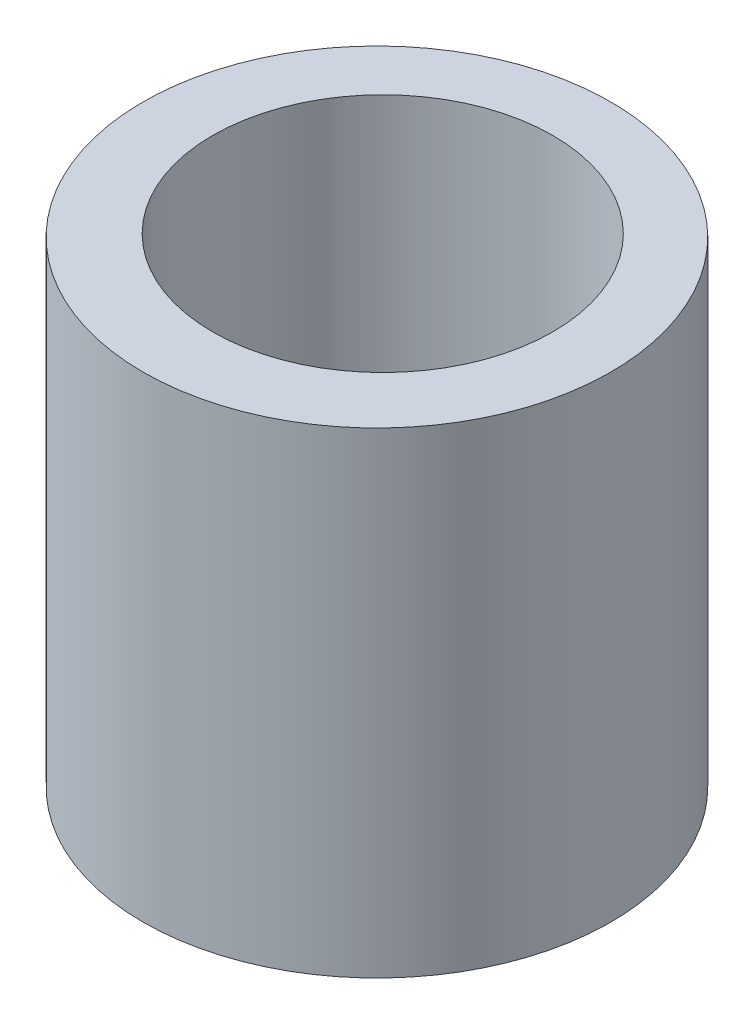
ISO-10303-21;
HEADER;
FILE_DESCRIPTION(('STEP AP214'),'2;1');
FILE_NAME('part.step','',(''),(''),'','','');
FILE_SCHEMA(('AUTOMOTIVE_DESIGN { 1 0 10303 214 1 1 1 1 }'));
ENDSEC;
DATA;
#1=APPLICATION_CONTEXT('core data for automotive mechanical design processes');
#2=APPLICATION_PROTOCOL_DEFINITION('international standard','automotive_design',2000,#1);
#3=PRODUCT_CONTEXT('',#1,'mechanical');
#4=PRODUCT('Part','Part','',(#3));
#5=PRODUCT_RELATED_PRODUCT_CATEGORY('part','',(#4));
#6=PRODUCT_DEFINITION_FORMATION('','',#4);
#7=PRODUCT_DEFINITION_CONTEXT('part definition',#1,'design');
#8=PRODUCT_DEFINITION('design','',#6,#7);
#9=PRODUCT_DEFINITION_SHAPE('','',#8);
#10=(LENGTH_UNIT() NAMED_UNIT(*) SI_UNIT(.MILLI.,.METRE.));
#11=(NAMED_UNIT(*) PLANE_ANGLE_UNIT() SI_UNIT($,.RADIAN.));
#12=(NAMED_UNIT(*) SI_UNIT($,.STERADIAN.) SOLID_ANGLE_UNIT());
#13=UNCERTAINTY_MEASURE_WITH_UNIT(LENGTH_MEASURE(1.E-05),#10,'distance_accuracy_value','');
#14=(GEOMETRIC_REPRESENTATION_CONTEXT(3) GLOBAL_UNCERTAINTY_ASSIGNED_CONTEXT((#13)) GLOBAL_UNIT_ASSIGNED_CONTEXT((#10,
#11,#12)) REPRESENTATION_CONTEXT('',''));
#15=CARTESIAN_POINT('',(0.,0.,0.));
#16=DIRECTION('',(0.,0.,1.));
#17=DIRECTION('',(1.,0.,0.));
#18=AXIS2_PLACEMENT_3D('',#15,#16,#17);
#19=CARTESIAN_POINT('',(0.,14.224,0.172602908569297));
#20=DIRECTION('',(0.,1.,0.));
#21=DIRECTION('',(0.,0.,1.));
#22=AXIS2_PLACEMENT_3D('',#19,#20,#21);
#23=PLANE('',#22);
#24=CARTESIAN_POINT('',(0.,14.224,0.172602908569297));
#25=DIRECTION('',(0.,1.,0.));
#26=DIRECTION('',(0.,0.,1.));
#27=AXIS2_PLACEMENT_3D('',#24,#25,#26);
#28=CIRCLE('',#27,6.985);
#29=CARTESIAN_POINT('',(0.,14.224,7.1576029085693));
#30=VERTEX_POINT('',#29);
#31=EDGE_CURVE('E10',#30,#30,#28,.T.);
#32=ORIENTED_EDGE('',*,*,#31,.T.);
#33=EDGE_LOOP('',(#32));
#34=FACE_BOUND('',#33,.T.);
#35=CARTESIAN_POINT('',(0.,14.224,0.));
#36=DIRECTION('',(0.,1.,0.));
#37=DIRECTION('',(0.,0.,1.));
#38=AXIS2_PLACEMENT_3D('',#35,#36,#37);
#39=CIRCLE('',#38,5.08);
#40=CARTESIAN_POINT('',(0.,14.224,5.08));
#41=VERTEX_POINT('',#40);
#42=EDGE_CURVE('E42',#41,#41,#39,.T.);
#43=ORIENTED_EDGE('',*,*,#42,.F.);
#44=EDGE_LOOP('',(#43));
#45=FACE_BOUND('',#44,.T.);
#46=ADVANCED_FACE('F31',(#34,#45),#23,.T.);
#47=CARTESIAN_POINT('',(0.,0.,0.172602908569297));
#48=DIRECTION('',(0.,1.,0.));
#49=DIRECTION('',(0.,0.,1.));
#50=AXIS2_PLACEMENT_3D('',#47,#48,#49);
#51=PLANE('',#50);
#52=CARTESIAN_POINT('',(0.,0.,0.172602908569297));
#53=DIRECTION('',(0.,1.,0.));
#54=DIRECTION('',(0.,0.,1.));
#55=AXIS2_PLACEMENT_3D('',#52,#53,#54);
#56=CIRCLE('',#55,6.985);
#57=CARTESIAN_POINT('',(0.,0.,7.1576029085693));
#58=VERTEX_POINT('',#57);
#59=EDGE_CURVE('E35',#58,#58,#56,.T.);
#60=ORIENTED_EDGE('',*,*,#59,.F.);
#61=EDGE_LOOP('',(#60));
#62=FACE_BOUND('',#61,.T.);
#63=CARTESIAN_POINT('',(0.,0.,0.));
#64=DIRECTION('',(0.,1.,0.));
#65=DIRECTION('',(0.,0.,1.));
#66=AXIS2_PLACEMENT_3D('',#63,#64,#65);
#67=CIRCLE('',#66,5.08);
#68=CARTESIAN_POINT('',(0.,0.,5.08));
#69=VERTEX_POINT('',#68);
#70=EDGE_CURVE('E44',#69,#69,#67,.T.);
#71=ORIENTED_EDGE('',*,*,#70,.T.);
#72=EDGE_LOOP('',(#71));
#73=FACE_BOUND('',#72,.T.);
#74=ADVANCED_FACE('F54',(#62,#73),#51,.F.);
#75=CARTESIAN_POINT('',(0.,14.224,0.172602908569297));
#76=DIRECTION('',(0.,-1.,0.));
#77=DIRECTION('',(0.,0.,-1.));
#78=AXIS2_PLACEMENT_3D('',#75,#76,#77);
#79=CYLINDRICAL_SURFACE('',#78,6.985);
#80=ORIENTED_EDGE('',*,*,#31,.F.);
#81=EDGE_LOOP('',(#80));
#82=FACE_BOUND('',#81,.T.);
#83=ORIENTED_EDGE('',*,*,#59,.T.);
#84=EDGE_LOOP('',(#83));
#85=FACE_BOUND('',#84,.T.);
#86=ADVANCED_FACE('F33',(#82,#85),#79,.T.);
#87=CARTESIAN_POINT('',(0.,14.224,0.));
#88=DIRECTION('',(0.,-1.,0.));
#89=DIRECTION('',(0.,0.,-1.));
#90=AXIS2_PLACEMENT_3D('',#87,#88,#89);
#91=CYLINDRICAL_SURFACE('',#90,5.08);
#92=ORIENTED_EDGE('',*,*,#42,.T.);
#93=EDGE_LOOP('',(#92));
#94=FACE_BOUND('',#93,.T.);
#95=ORIENTED_EDGE('',*,*,#70,.F.);
#96=EDGE_LOOP('',(#95));
#97=FACE_BOUND('',#96,.T.);
#98=ADVANCED_FACE('F50',(#94,#97),#91,.F.);
#99=CLOSED_SHELL('',(#46,#74,#86,#98));
#100=MANIFOLD_SOLID_BREP('B2',#99);
#101=ADVANCED_BREP_SHAPE_REPRESENTATION('',(#18,#100),#14);
#102=SHAPE_DEFINITION_REPRESENTATION(#9,#101);
ENDSEC;
END-ISO-10303-21;
